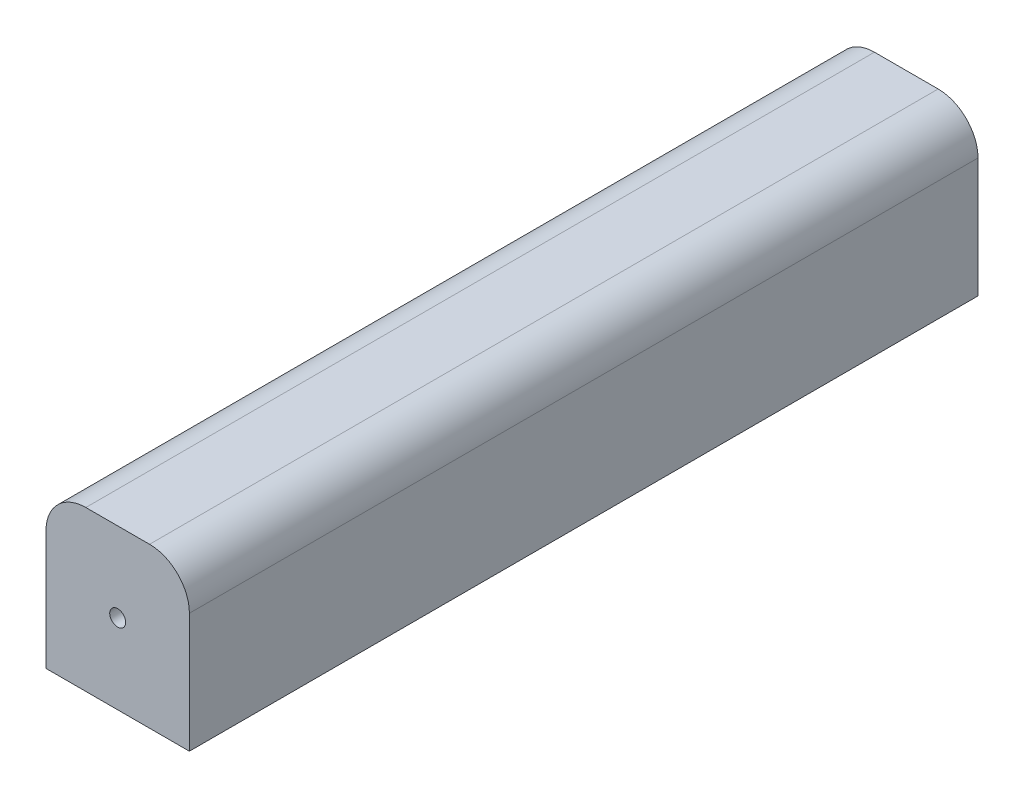
ISO-10303-21;
HEADER;
FILE_DESCRIPTION(('STEP AP214'),'2;1');
FILE_NAME('part.step','',(''),(''),'','','');
FILE_SCHEMA(('AUTOMOTIVE_DESIGN { 1 0 10303 214 1 1 1 1 }'));
ENDSEC;
DATA;
#1=APPLICATION_CONTEXT('core data for automotive mechanical design processes');
#2=APPLICATION_PROTOCOL_DEFINITION('international standard','automotive_design',2000,#1);
#3=PRODUCT_CONTEXT('',#1,'mechanical');
#4=PRODUCT('Part','Part','',(#3));
#5=PRODUCT_RELATED_PRODUCT_CATEGORY('part','',(#4));
#6=PRODUCT_DEFINITION_FORMATION('','',#4);
#7=PRODUCT_DEFINITION_CONTEXT('part definition',#1,'design');
#8=PRODUCT_DEFINITION('design','',#6,#7);
#9=PRODUCT_DEFINITION_SHAPE('','',#8);
#10=(LENGTH_UNIT() NAMED_UNIT(*) SI_UNIT(.MILLI.,.METRE.));
#11=(NAMED_UNIT(*) PLANE_ANGLE_UNIT() SI_UNIT($,.RADIAN.));
#12=(NAMED_UNIT(*) SI_UNIT($,.STERADIAN.) SOLID_ANGLE_UNIT());
#13=UNCERTAINTY_MEASURE_WITH_UNIT(LENGTH_MEASURE(1.E-05),#10,'distance_accuracy_value','');
#14=(GEOMETRIC_REPRESENTATION_CONTEXT(3) GLOBAL_UNCERTAINTY_ASSIGNED_CONTEXT((#13)) GLOBAL_UNIT_ASSIGNED_CONTEXT((#10,
#11,#12)) REPRESENTATION_CONTEXT('',''));
#15=CARTESIAN_POINT('',(0.,0.,0.));
#16=DIRECTION('',(0.,0.,1.));
#17=DIRECTION('',(1.,0.,0.));
#18=AXIS2_PLACEMENT_3D('',#15,#16,#17);
#19=CARTESIAN_POINT('',(9.,4.99999999999997,99.));
#20=DIRECTION('',(-1.,0.,0.));
#21=DIRECTION('',(0.,-1.,0.));
#22=AXIS2_PLACEMENT_3D('',#19,#20,#21);
#23=PLANE('',#22);
#24=DIRECTION('',(0.,1.,0.));
#25=VECTOR('',#24,1.);
#26=CARTESIAN_POINT('',(9.,4.99999999999997,0.));
#27=LINE('',#26,#25);
#28=CARTESIAN_POINT('',(9.,-10.,0.));
#29=VERTEX_POINT('',#28);
#30=CARTESIAN_POINT('',(9.,4.99999999999997,0.));
#31=VERTEX_POINT('',#30);
#32=EDGE_CURVE('E119',#29,#31,#27,.T.);
#33=ORIENTED_EDGE('',*,*,#32,.T.);
#34=DIRECTION('',(0.,0.,-1.));
#35=VECTOR('',#34,1.);
#36=CARTESIAN_POINT('',(9.,4.99999999999997,99.));
#37=LINE('',#36,#35);
#38=CARTESIAN_POINT('',(9.,4.99999999999997,99.));
#39=VERTEX_POINT('',#38);
#40=EDGE_CURVE('E11',#39,#31,#37,.T.);
#41=ORIENTED_EDGE('',*,*,#40,.F.);
#42=DIRECTION('',(0.,1.,0.));
#43=VECTOR('',#42,1.);
#44=CARTESIAN_POINT('',(9.,4.99999999999997,99.));
#45=LINE('',#44,#43);
#46=CARTESIAN_POINT('',(9.,-10.,99.));
#47=VERTEX_POINT('',#46);
#48=EDGE_CURVE('E130',#47,#39,#45,.T.);
#49=ORIENTED_EDGE('',*,*,#48,.F.);
#50=DIRECTION('',(0.,0.,-1.));
#51=VECTOR('',#50,1.);
#52=CARTESIAN_POINT('',(9.,-10.,99.));
#53=LINE('',#52,#51);
#54=EDGE_CURVE('E115',#47,#29,#53,.T.);
#55=ORIENTED_EDGE('',*,*,#54,.T.);
#56=EDGE_LOOP('',(#33,#41,#49,#55));
#57=FACE_BOUND('',#56,.T.);
#58=ADVANCED_FACE('F35',(#57),#23,.F.);
#59=CARTESIAN_POINT('',(4.,5.,99.));
#60=DIRECTION('',(0.,0.,-1.));
#61=DIRECTION('',(-1.,0.,0.));
#62=AXIS2_PLACEMENT_3D('',#59,#60,#61);
#63=CYLINDRICAL_SURFACE('',#62,5.);
#64=CARTESIAN_POINT('',(4.,5.,0.));
#65=DIRECTION('',(0.,0.,1.));
#66=DIRECTION('',(-1.,0.,0.));
#67=AXIS2_PLACEMENT_3D('',#64,#65,#66);
#68=CIRCLE('',#67,5.);
#69=CARTESIAN_POINT('',(3.99999999999997,10.,0.));
#70=VERTEX_POINT('',#69);
#71=EDGE_CURVE('E122',#31,#70,#68,.T.);
#72=ORIENTED_EDGE('',*,*,#71,.T.);
#73=DIRECTION('',(0.,0.,-1.));
#74=VECTOR('',#73,1.);
#75=CARTESIAN_POINT('',(3.99999999999997,10.,99.));
#76=LINE('',#75,#74);
#77=CARTESIAN_POINT('',(3.99999999999997,10.,99.));
#78=VERTEX_POINT('',#77);
#79=EDGE_CURVE('E43',#78,#70,#76,.T.);
#80=ORIENTED_EDGE('',*,*,#79,.F.);
#81=CARTESIAN_POINT('',(4.,5.,99.));
#82=DIRECTION('',(0.,0.,1.));
#83=DIRECTION('',(-1.,0.,0.));
#84=AXIS2_PLACEMENT_3D('',#81,#82,#83);
#85=CIRCLE('',#84,5.);
#86=EDGE_CURVE('E88',#39,#78,#85,.T.);
#87=ORIENTED_EDGE('',*,*,#86,.F.);
#88=ORIENTED_EDGE('',*,*,#40,.T.);
#89=EDGE_LOOP('',(#72,#80,#87,#88));
#90=FACE_BOUND('',#89,.T.);
#91=ADVANCED_FACE('F155',(#90),#63,.T.);
#92=CARTESIAN_POINT('',(-3.99999999999996,10.,99.));
#93=DIRECTION('',(0.,-1.,0.));
#94=DIRECTION('',(0.,0.,-1.));
#95=AXIS2_PLACEMENT_3D('',#92,#93,#94);
#96=PLANE('',#95);
#97=DIRECTION('',(-1.,0.,0.));
#98=VECTOR('',#97,1.);
#99=CARTESIAN_POINT('',(-3.99999999999996,10.,0.));
#100=LINE('',#99,#98);
#101=CARTESIAN_POINT('',(-3.99999999999996,10.,0.));
#102=VERTEX_POINT('',#101);
#103=EDGE_CURVE('E125',#70,#102,#100,.T.);
#104=ORIENTED_EDGE('',*,*,#103,.T.);
#105=DIRECTION('',(0.,0.,-1.));
#106=VECTOR('',#105,1.);
#107=CARTESIAN_POINT('',(-3.99999999999996,10.,99.));
#108=LINE('',#107,#106);
#109=CARTESIAN_POINT('',(-3.99999999999996,10.,99.));
#110=VERTEX_POINT('',#109);
#111=EDGE_CURVE('E110',#110,#102,#108,.T.);
#112=ORIENTED_EDGE('',*,*,#111,.F.);
#113=DIRECTION('',(-1.,0.,0.));
#114=VECTOR('',#113,1.);
#115=CARTESIAN_POINT('',(-3.99999999999996,10.,99.));
#116=LINE('',#115,#114);
#117=EDGE_CURVE('E101',#78,#110,#116,.T.);
#118=ORIENTED_EDGE('',*,*,#117,.F.);
#119=ORIENTED_EDGE('',*,*,#79,.T.);
#120=EDGE_LOOP('',(#104,#112,#118,#119));
#121=FACE_BOUND('',#120,.T.);
#122=ADVANCED_FACE('F136',(#121),#96,.F.);
#123=CARTESIAN_POINT('',(-4.,5.,99.));
#124=DIRECTION('',(0.,0.,-1.));
#125=DIRECTION('',(-1.,0.,0.));
#126=AXIS2_PLACEMENT_3D('',#123,#124,#125);
#127=CYLINDRICAL_SURFACE('',#126,5.);
#128=CARTESIAN_POINT('',(-4.,5.,0.));
#129=DIRECTION('',(0.,0.,1.));
#130=DIRECTION('',(1.,0.,0.));
#131=AXIS2_PLACEMENT_3D('',#128,#129,#130);
#132=CIRCLE('',#131,5.);
#133=CARTESIAN_POINT('',(-9.,4.99999999999996,0.));
#134=VERTEX_POINT('',#133);
#135=EDGE_CURVE('E109',#102,#134,#132,.T.);
#136=ORIENTED_EDGE('',*,*,#135,.T.);
#137=DIRECTION('',(0.,0.,-1.));
#138=VECTOR('',#137,1.);
#139=CARTESIAN_POINT('',(-9.,4.99999999999996,99.));
#140=LINE('',#139,#138);
#141=CARTESIAN_POINT('',(-9.,4.99999999999996,99.));
#142=VERTEX_POINT('',#141);
#143=EDGE_CURVE('E106',#142,#134,#140,.T.);
#144=ORIENTED_EDGE('',*,*,#143,.F.);
#145=CARTESIAN_POINT('',(-4.,5.,99.));
#146=DIRECTION('',(0.,0.,1.));
#147=DIRECTION('',(1.,0.,0.));
#148=AXIS2_PLACEMENT_3D('',#145,#146,#147);
#149=CIRCLE('',#148,5.);
#150=EDGE_CURVE('E95',#110,#142,#149,.T.);
#151=ORIENTED_EDGE('',*,*,#150,.F.);
#152=ORIENTED_EDGE('',*,*,#111,.T.);
#153=EDGE_LOOP('',(#136,#144,#151,#152));
#154=FACE_BOUND('',#153,.T.);
#155=ADVANCED_FACE('F107',(#154),#127,.T.);
#156=CARTESIAN_POINT('',(-9.,4.99999999999996,99.));
#157=DIRECTION('',(1.,0.,0.));
#158=DIRECTION('',(0.,0.,-1.));
#159=AXIS2_PLACEMENT_3D('',#156,#157,#158);
#160=PLANE('',#159);
#161=DIRECTION('',(0.,-1.,0.));
#162=VECTOR('',#161,1.);
#163=CARTESIAN_POINT('',(-9.,4.99999999999996,0.));
#164=LINE('',#163,#162);
#165=CARTESIAN_POINT('',(-9.,-10.,0.));
#166=VERTEX_POINT('',#165);
#167=EDGE_CURVE('E74',#134,#166,#164,.T.);
#168=ORIENTED_EDGE('',*,*,#167,.T.);
#169=DIRECTION('',(0.,0.,-1.));
#170=VECTOR('',#169,1.);
#171=CARTESIAN_POINT('',(-9.,-10.,99.));
#172=LINE('',#171,#170);
#173=CARTESIAN_POINT('',(-9.,-10.,99.));
#174=VERTEX_POINT('',#173);
#175=EDGE_CURVE('E111',#174,#166,#172,.T.);
#176=ORIENTED_EDGE('',*,*,#175,.F.);
#177=DIRECTION('',(0.,-1.,0.));
#178=VECTOR('',#177,1.);
#179=CARTESIAN_POINT('',(-9.,4.99999999999996,99.));
#180=LINE('',#179,#178);
#181=EDGE_CURVE('E99',#142,#174,#180,.T.);
#182=ORIENTED_EDGE('',*,*,#181,.F.);
#183=ORIENTED_EDGE('',*,*,#143,.T.);
#184=EDGE_LOOP('',(#168,#176,#182,#183));
#185=FACE_BOUND('',#184,.T.);
#186=ADVANCED_FACE('F113',(#185),#160,.F.);
#187=CARTESIAN_POINT('',(-9.,-10.,99.));
#188=DIRECTION('',(0.,1.,0.));
#189=DIRECTION('',(0.,0.,1.));
#190=AXIS2_PLACEMENT_3D('',#187,#188,#189);
#191=PLANE('',#190);
#192=DIRECTION('',(1.,0.,0.));
#193=VECTOR('',#192,1.);
#194=CARTESIAN_POINT('',(-9.,-10.,0.));
#195=LINE('',#194,#193);
#196=EDGE_CURVE('E80',#166,#29,#195,.T.);
#197=ORIENTED_EDGE('',*,*,#196,.T.);
#198=ORIENTED_EDGE('',*,*,#54,.F.);
#199=DIRECTION('',(1.,0.,0.));
#200=VECTOR('',#199,1.);
#201=CARTESIAN_POINT('',(-9.,-10.,99.));
#202=LINE('',#201,#200);
#203=EDGE_CURVE('E51',#174,#47,#202,.T.);
#204=ORIENTED_EDGE('',*,*,#203,.F.);
#205=ORIENTED_EDGE('',*,*,#175,.T.);
#206=EDGE_LOOP('',(#197,#198,#204,#205));
#207=FACE_BOUND('',#206,.T.);
#208=ADVANCED_FACE('F143',(#207),#191,.F.);
#209=CARTESIAN_POINT('',(-4.,5.,99.));
#210=DIRECTION('',(0.,0.,1.));
#211=DIRECTION('',(1.,0.,0.));
#212=AXIS2_PLACEMENT_3D('',#209,#210,#211);
#213=PLANE('',#212);
#214=CARTESIAN_POINT('',(0.,0.,99.));
#215=DIRECTION('',(0.,0.,1.));
#216=DIRECTION('',(1.,0.,0.));
#217=AXIS2_PLACEMENT_3D('',#214,#215,#216);
#218=CIRCLE('',#217,1.);
#219=CARTESIAN_POINT('',(1.,0.,99.));
#220=VERTEX_POINT('',#219);
#221=EDGE_CURVE('E238',#220,#220,#218,.T.);
#222=ORIENTED_EDGE('',*,*,#221,.F.);
#223=EDGE_LOOP('',(#222));
#224=FACE_BOUND('',#223,.T.);
#225=ORIENTED_EDGE('',*,*,#48,.T.);
#226=ORIENTED_EDGE('',*,*,#86,.T.);
#227=ORIENTED_EDGE('',*,*,#117,.T.);
#228=ORIENTED_EDGE('',*,*,#150,.T.);
#229=ORIENTED_EDGE('',*,*,#181,.T.);
#230=ORIENTED_EDGE('',*,*,#203,.T.);
#231=EDGE_LOOP('',(#225,#226,#227,#228,#229,#230));
#232=FACE_BOUND('',#231,.T.);
#233=ADVANCED_FACE('F97',(#224,#232),#213,.T.);
#234=CARTESIAN_POINT('',(-4.,5.,0.));
#235=DIRECTION('',(0.,0.,1.));
#236=DIRECTION('',(1.,0.,0.));
#237=AXIS2_PLACEMENT_3D('',#234,#235,#236);
#238=PLANE('',#237);
#239=CARTESIAN_POINT('',(0.,0.,0.));
#240=DIRECTION('',(0.,0.,-1.));
#241=DIRECTION('',(-1.,0.,0.));
#242=AXIS2_PLACEMENT_3D('',#239,#240,#241);
#243=CIRCLE('',#242,1.);
#244=CARTESIAN_POINT('',(-1.,0.,0.));
#245=VERTEX_POINT('',#244);
#246=EDGE_CURVE('E239',#245,#245,#243,.T.);
#247=ORIENTED_EDGE('',*,*,#246,.F.);
#248=EDGE_LOOP('',(#247));
#249=FACE_BOUND('',#248,.T.);
#250=ORIENTED_EDGE('',*,*,#32,.F.);
#251=ORIENTED_EDGE('',*,*,#196,.F.);
#252=ORIENTED_EDGE('',*,*,#167,.F.);
#253=ORIENTED_EDGE('',*,*,#135,.F.);
#254=ORIENTED_EDGE('',*,*,#103,.F.);
#255=ORIENTED_EDGE('',*,*,#71,.F.);
#256=EDGE_LOOP('',(#250,#251,#252,#253,#254,#255));
#257=FACE_BOUND('',#256,.T.);
#258=ADVANCED_FACE('F139',(#249,#257),#238,.F.);
#259=CARTESIAN_POINT('',(0.,0.,94.));
#260=DIRECTION('',(0.,0.,1.));
#261=DIRECTION('',(1.,0.,0.));
#262=AXIS2_PLACEMENT_3D('',#259,#260,#261);
#263=CYLINDRICAL_SURFACE('',#262,1.);
#264=CARTESIAN_POINT('',(0.,0.,94.));
#265=DIRECTION('',(0.,0.,1.));
#266=DIRECTION('',(1.,0.,0.));
#267=AXIS2_PLACEMENT_3D('',#264,#265,#266);
#268=CIRCLE('',#267,1.);
#269=CARTESIAN_POINT('',(1.,0.,94.));
#270=VERTEX_POINT('',#269);
#271=EDGE_CURVE('E123',#270,#270,#268,.T.);
#272=ORIENTED_EDGE('',*,*,#271,.F.);
#273=EDGE_LOOP('',(#272));
#274=FACE_BOUND('',#273,.T.);
#275=ORIENTED_EDGE('',*,*,#221,.T.);
#276=EDGE_LOOP('',(#275));
#277=FACE_BOUND('',#276,.T.);
#278=ADVANCED_FACE('F190',(#274,#277),#263,.F.);
#279=CARTESIAN_POINT('',(0.,0.,94.));
#280=DIRECTION('',(0.,0.,1.));
#281=DIRECTION('',(1.,0.,0.));
#282=AXIS2_PLACEMENT_3D('',#279,#280,#281);
#283=PLANE('',#282);
#284=ORIENTED_EDGE('',*,*,#271,.T.);
#285=EDGE_LOOP('',(#284));
#286=FACE_BOUND('',#285,.T.);
#287=ADVANCED_FACE('F195',(#286),#283,.T.);
#288=CARTESIAN_POINT('',(0.,0.,5.));
#289=DIRECTION('',(0.,0.,-1.));
#290=DIRECTION('',(-1.,0.,0.));
#291=AXIS2_PLACEMENT_3D('',#288,#289,#290);
#292=CYLINDRICAL_SURFACE('',#291,1.);
#293=CARTESIAN_POINT('',(0.,0.,5.));
#294=DIRECTION('',(0.,0.,-1.));
#295=DIRECTION('',(-1.,0.,0.));
#296=AXIS2_PLACEMENT_3D('',#293,#294,#295);
#297=CIRCLE('',#296,1.);
#298=CARTESIAN_POINT('',(-1.,0.,5.));
#299=VERTEX_POINT('',#298);
#300=EDGE_CURVE('E237',#299,#299,#297,.T.);
#301=ORIENTED_EDGE('',*,*,#300,.F.);
#302=EDGE_LOOP('',(#301));
#303=FACE_BOUND('',#302,.T.);
#304=ORIENTED_EDGE('',*,*,#246,.T.);
#305=EDGE_LOOP('',(#304));
#306=FACE_BOUND('',#305,.T.);
#307=ADVANCED_FACE('F205',(#303,#306),#292,.F.);
#308=CARTESIAN_POINT('',(0.,0.,5.));
#309=DIRECTION('',(0.,0.,-1.));
#310=DIRECTION('',(-1.,0.,0.));
#311=AXIS2_PLACEMENT_3D('',#308,#309,#310);
#312=PLANE('',#311);
#313=ORIENTED_EDGE('',*,*,#300,.T.);
#314=EDGE_LOOP('',(#313));
#315=FACE_BOUND('',#314,.T.);
#316=ADVANCED_FACE('F221',(#315),#312,.T.);
#317=CLOSED_SHELL('',(#58,#91,#122,#155,#186,#208,#233,#258,#278,#287,#307,#316));
#318=MANIFOLD_SOLID_BREP('B2',#317);
#319=ADVANCED_BREP_SHAPE_REPRESENTATION('',(#18,#318),#14);
#320=SHAPE_DEFINITION_REPRESENTATION(#9,#319);
ENDSEC;
END-ISO-10303-21;
